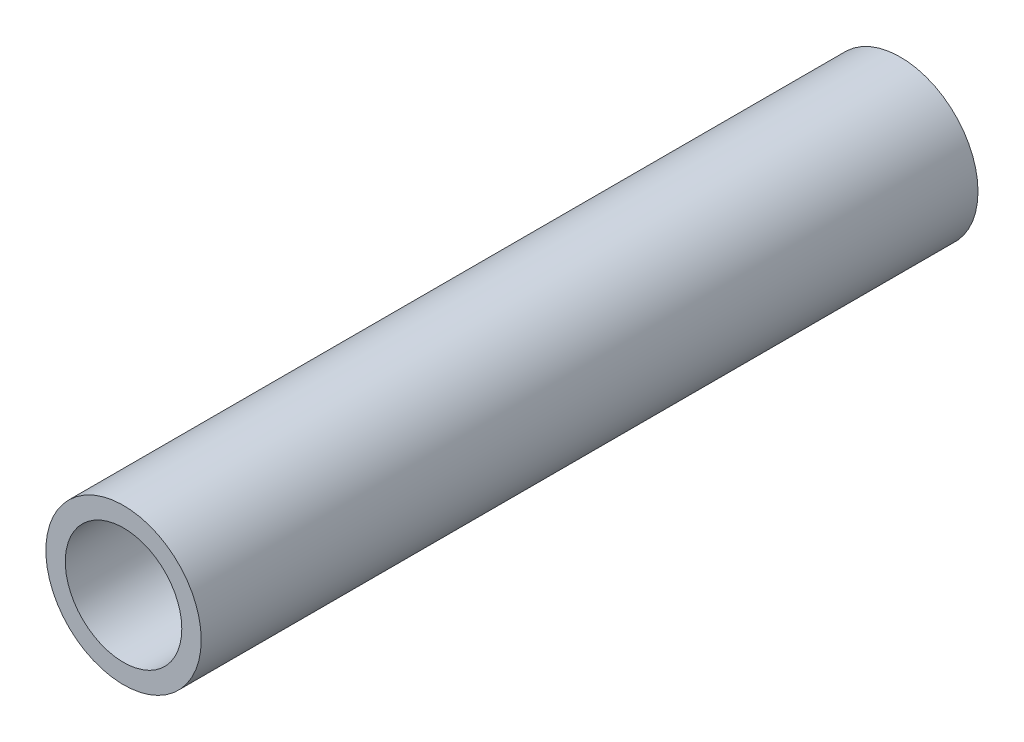
ISO-10303-21;
HEADER;
FILE_DESCRIPTION(('STEP AP214'),'2;1');
FILE_NAME('part.step','',(''),(''),'','','');
FILE_SCHEMA(('AUTOMOTIVE_DESIGN { 1 0 10303 214 1 1 1 1 }'));
ENDSEC;
DATA;
#1=APPLICATION_CONTEXT('core data for automotive mechanical design processes');
#2=APPLICATION_PROTOCOL_DEFINITION('international standard','automotive_design',2000,#1);
#3=PRODUCT_CONTEXT('',#1,'mechanical');
#4=PRODUCT('Part','Part','',(#3));
#5=PRODUCT_RELATED_PRODUCT_CATEGORY('part','',(#4));
#6=PRODUCT_DEFINITION_FORMATION('','',#4);
#7=PRODUCT_DEFINITION_CONTEXT('part definition',#1,'design');
#8=PRODUCT_DEFINITION('design','',#6,#7);
#9=PRODUCT_DEFINITION_SHAPE('','',#8);
#10=(LENGTH_UNIT() NAMED_UNIT(*) SI_UNIT(.MILLI.,.METRE.));
#11=(NAMED_UNIT(*) PLANE_ANGLE_UNIT() SI_UNIT($,.RADIAN.));
#12=(NAMED_UNIT(*) SI_UNIT($,.STERADIAN.) SOLID_ANGLE_UNIT());
#13=UNCERTAINTY_MEASURE_WITH_UNIT(LENGTH_MEASURE(1.E-05),#10,'distance_accuracy_value','');
#14=(GEOMETRIC_REPRESENTATION_CONTEXT(3) GLOBAL_UNCERTAINTY_ASSIGNED_CONTEXT((#13)) GLOBAL_UNIT_ASSIGNED_CONTEXT((#10,
#11,#12)) REPRESENTATION_CONTEXT('',''));
#15=CARTESIAN_POINT('',(0.,0.,0.));
#16=DIRECTION('',(0.,0.,1.));
#17=DIRECTION('',(1.,0.,0.));
#18=AXIS2_PLACEMENT_3D('',#15,#16,#17);
#19=CARTESIAN_POINT('',(0.,0.,10.));
#20=DIRECTION('',(0.,0.,1.));
#21=DIRECTION('',(1.,0.,0.));
#22=AXIS2_PLACEMENT_3D('',#19,#20,#21);
#23=PLANE('',#22);
#24=CARTESIAN_POINT('',(0.,0.,10.));
#25=DIRECTION('',(0.,0.,1.));
#26=DIRECTION('',(1.,0.,0.));
#27=AXIS2_PLACEMENT_3D('',#24,#25,#26);
#28=CIRCLE('',#27,2.);
#29=CARTESIAN_POINT('',(2.,0.,10.));
#30=VERTEX_POINT('',#29);
#31=EDGE_CURVE('E10',#30,#30,#28,.T.);
#32=ORIENTED_EDGE('',*,*,#31,.T.);
#33=EDGE_LOOP('',(#32));
#34=FACE_BOUND('',#33,.T.);
#35=CARTESIAN_POINT('',(0.,0.,10.));
#36=DIRECTION('',(0.,0.,1.));
#37=DIRECTION('',(1.,0.,0.));
#38=AXIS2_PLACEMENT_3D('',#35,#36,#37);
#39=CIRCLE('',#38,1.5);
#40=CARTESIAN_POINT('',(1.5,0.,10.));
#41=VERTEX_POINT('',#40);
#42=EDGE_CURVE('E41',#41,#41,#39,.T.);
#43=ORIENTED_EDGE('',*,*,#42,.F.);
#44=EDGE_LOOP('',(#43));
#45=FACE_BOUND('',#44,.T.);
#46=ADVANCED_FACE('F30',(#34,#45),#23,.T.);
#47=CARTESIAN_POINT('',(0.,0.,-10.));
#48=DIRECTION('',(0.,0.,1.));
#49=DIRECTION('',(1.,0.,0.));
#50=AXIS2_PLACEMENT_3D('',#47,#48,#49);
#51=PLANE('',#50);
#52=CARTESIAN_POINT('',(0.,0.,-10.));
#53=DIRECTION('',(0.,0.,1.));
#54=DIRECTION('',(1.,0.,0.));
#55=AXIS2_PLACEMENT_3D('',#52,#53,#54);
#56=CIRCLE('',#55,2.);
#57=CARTESIAN_POINT('',(2.,0.,-10.));
#58=VERTEX_POINT('',#57);
#59=EDGE_CURVE('E34',#58,#58,#56,.T.);
#60=ORIENTED_EDGE('',*,*,#59,.F.);
#61=EDGE_LOOP('',(#60));
#62=FACE_BOUND('',#61,.T.);
#63=CARTESIAN_POINT('',(0.,0.,-10.));
#64=DIRECTION('',(0.,0.,1.));
#65=DIRECTION('',(1.,0.,0.));
#66=AXIS2_PLACEMENT_3D('',#63,#64,#65);
#67=CIRCLE('',#66,1.5);
#68=CARTESIAN_POINT('',(1.5,0.,-10.));
#69=VERTEX_POINT('',#68);
#70=EDGE_CURVE('E43',#69,#69,#67,.T.);
#71=ORIENTED_EDGE('',*,*,#70,.T.);
#72=EDGE_LOOP('',(#71));
#73=FACE_BOUND('',#72,.T.);
#74=ADVANCED_FACE('F53',(#62,#73),#51,.F.);
#75=CARTESIAN_POINT('',(0.,0.,10.));
#76=DIRECTION('',(0.,0.,-1.));
#77=DIRECTION('',(-1.,0.,0.));
#78=AXIS2_PLACEMENT_3D('',#75,#76,#77);
#79=CYLINDRICAL_SURFACE('',#78,2.);
#80=ORIENTED_EDGE('',*,*,#31,.F.);
#81=EDGE_LOOP('',(#80));
#82=FACE_BOUND('',#81,.T.);
#83=ORIENTED_EDGE('',*,*,#59,.T.);
#84=EDGE_LOOP('',(#83));
#85=FACE_BOUND('',#84,.T.);
#86=ADVANCED_FACE('F32',(#82,#85),#79,.T.);
#87=CARTESIAN_POINT('',(0.,0.,10.));
#88=DIRECTION('',(0.,0.,-1.));
#89=DIRECTION('',(-1.,0.,0.));
#90=AXIS2_PLACEMENT_3D('',#87,#88,#89);
#91=CYLINDRICAL_SURFACE('',#90,1.5);
#92=ORIENTED_EDGE('',*,*,#42,.T.);
#93=EDGE_LOOP('',(#92));
#94=FACE_BOUND('',#93,.T.);
#95=ORIENTED_EDGE('',*,*,#70,.F.);
#96=EDGE_LOOP('',(#95));
#97=FACE_BOUND('',#96,.T.);
#98=ADVANCED_FACE('F49',(#94,#97),#91,.F.);
#99=CLOSED_SHELL('',(#46,#74,#86,#98));
#100=MANIFOLD_SOLID_BREP('B2',#99);
#101=ADVANCED_BREP_SHAPE_REPRESENTATION('',(#18,#100),#14);
#102=SHAPE_DEFINITION_REPRESENTATION(#9,#101);
ENDSEC;
END-ISO-10303-21;
